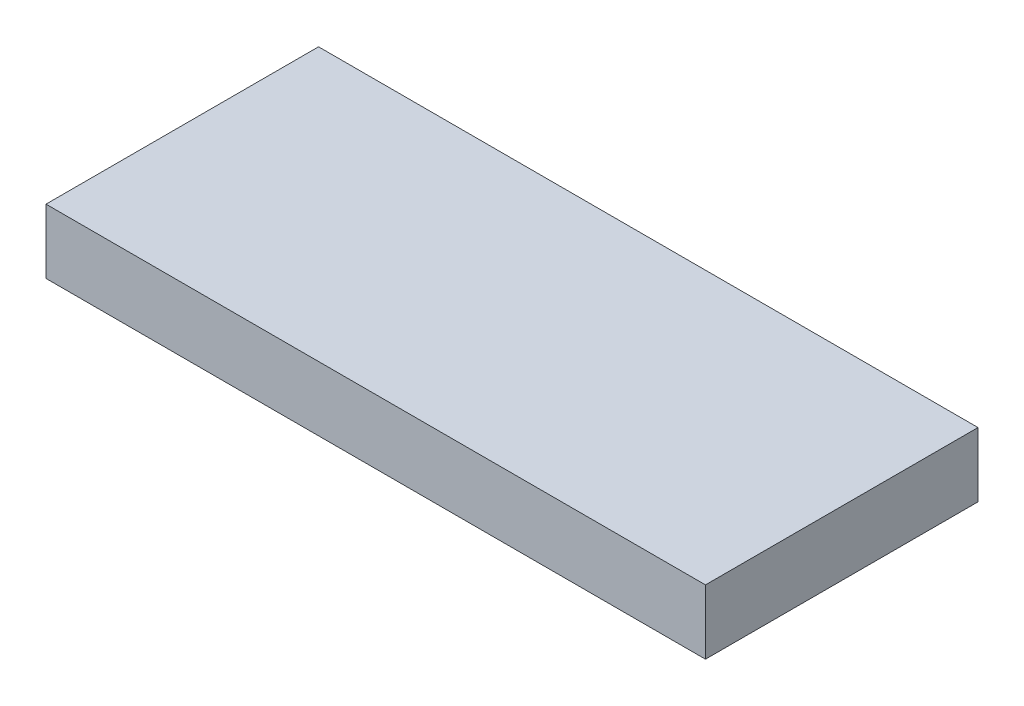
ISO-10303-21;
HEADER;
FILE_DESCRIPTION(('STEP AP214'),'2;1');
FILE_NAME('part.step','',(''),(''),'','','');
FILE_SCHEMA(('AUTOMOTIVE_DESIGN { 1 0 10303 214 1 1 1 1 }'));
ENDSEC;
DATA;
#1=APPLICATION_CONTEXT('core data for automotive mechanical design processes');
#2=APPLICATION_PROTOCOL_DEFINITION('international standard','automotive_design',2000,#1);
#3=PRODUCT_CONTEXT('',#1,'mechanical');
#4=PRODUCT('Part','Part','',(#3));
#5=PRODUCT_RELATED_PRODUCT_CATEGORY('part','',(#4));
#6=PRODUCT_DEFINITION_FORMATION('','',#4);
#7=PRODUCT_DEFINITION_CONTEXT('part definition',#1,'design');
#8=PRODUCT_DEFINITION('design','',#6,#7);
#9=PRODUCT_DEFINITION_SHAPE('','',#8);
#10=(LENGTH_UNIT() NAMED_UNIT(*) SI_UNIT(.MILLI.,.METRE.));
#11=(NAMED_UNIT(*) PLANE_ANGLE_UNIT() SI_UNIT($,.RADIAN.));
#12=(NAMED_UNIT(*) SI_UNIT($,.STERADIAN.) SOLID_ANGLE_UNIT());
#13=UNCERTAINTY_MEASURE_WITH_UNIT(LENGTH_MEASURE(1.E-05),#10,'distance_accuracy_value','');
#14=(GEOMETRIC_REPRESENTATION_CONTEXT(3) GLOBAL_UNCERTAINTY_ASSIGNED_CONTEXT((#13)) GLOBAL_UNIT_ASSIGNED_CONTEXT((#10,
#11,#12)) REPRESENTATION_CONTEXT('',''));
#15=CARTESIAN_POINT('',(0.,0.,0.));
#16=DIRECTION('',(0.,0.,1.));
#17=DIRECTION('',(1.,0.,0.));
#18=AXIS2_PLACEMENT_3D('',#15,#16,#17);
#19=CARTESIAN_POINT('',(-15.365,3.,6.35));
#20=DIRECTION('',(1.,0.,0.));
#21=DIRECTION('',(0.,0.,-1.));
#22=AXIS2_PLACEMENT_3D('',#19,#20,#21);
#23=PLANE('',#22);
#24=DIRECTION('',(0.,0.,1.));
#25=VECTOR('',#24,1.);
#26=CARTESIAN_POINT('',(-15.365,0.,6.35));
#27=LINE('',#26,#25);
#28=CARTESIAN_POINT('',(-15.365,0.,-6.35));
#29=VERTEX_POINT('',#28);
#30=CARTESIAN_POINT('',(-15.365,0.,6.35));
#31=VERTEX_POINT('',#30);
#32=EDGE_CURVE('E118',#29,#31,#27,.T.);
#33=ORIENTED_EDGE('',*,*,#32,.T.);
#34=DIRECTION('',(0.,-1.,0.));
#35=VECTOR('',#34,1.);
#36=CARTESIAN_POINT('',(-15.365,3.,6.35));
#37=LINE('',#36,#35);
#38=CARTESIAN_POINT('',(-15.365,3.,6.35));
#39=VERTEX_POINT('',#38);
#40=EDGE_CURVE('E11',#39,#31,#37,.T.);
#41=ORIENTED_EDGE('',*,*,#40,.F.);
#42=DIRECTION('',(0.,0.,1.));
#43=VECTOR('',#42,1.);
#44=CARTESIAN_POINT('',(-15.365,3.,6.35));
#45=LINE('',#44,#43);
#46=CARTESIAN_POINT('',(-15.365,3.,-6.35));
#47=VERTEX_POINT('',#46);
#48=EDGE_CURVE('E101',#47,#39,#45,.T.);
#49=ORIENTED_EDGE('',*,*,#48,.F.);
#50=DIRECTION('',(0.,-1.,0.));
#51=VECTOR('',#50,1.);
#52=CARTESIAN_POINT('',(-15.365,3.,-6.35));
#53=LINE('',#52,#51);
#54=EDGE_CURVE('E114',#47,#29,#53,.T.);
#55=ORIENTED_EDGE('',*,*,#54,.T.);
#56=EDGE_LOOP('',(#33,#41,#49,#55));
#57=FACE_BOUND('',#56,.T.);
#58=ADVANCED_FACE('F49',(#57),#23,.F.);
#59=CARTESIAN_POINT('',(15.365,3.,6.35));
#60=DIRECTION('',(0.,0.,-1.));
#61=DIRECTION('',(-1.,0.,0.));
#62=AXIS2_PLACEMENT_3D('',#59,#60,#61);
#63=PLANE('',#62);
#64=DIRECTION('',(1.,0.,0.));
#65=VECTOR('',#64,1.);
#66=CARTESIAN_POINT('',(15.365,0.,6.35));
#67=LINE('',#66,#65);
#68=CARTESIAN_POINT('',(15.365,0.,6.35));
#69=VERTEX_POINT('',#68);
#70=EDGE_CURVE('E106',#31,#69,#67,.T.);
#71=ORIENTED_EDGE('',*,*,#70,.T.);
#72=DIRECTION('',(0.,-1.,0.));
#73=VECTOR('',#72,1.);
#74=CARTESIAN_POINT('',(15.365,3.,6.35));
#75=LINE('',#74,#73);
#76=CARTESIAN_POINT('',(15.365,3.,6.35));
#77=VERTEX_POINT('',#76);
#78=EDGE_CURVE('E58',#77,#69,#75,.T.);
#79=ORIENTED_EDGE('',*,*,#78,.F.);
#80=DIRECTION('',(1.,0.,0.));
#81=VECTOR('',#80,1.);
#82=CARTESIAN_POINT('',(15.365,3.,6.35));
#83=LINE('',#82,#81);
#84=EDGE_CURVE('E96',#39,#77,#83,.T.);
#85=ORIENTED_EDGE('',*,*,#84,.F.);
#86=ORIENTED_EDGE('',*,*,#40,.T.);
#87=EDGE_LOOP('',(#71,#79,#85,#86));
#88=FACE_BOUND('',#87,.T.);
#89=ADVANCED_FACE('F105',(#88),#63,.F.);
#90=CARTESIAN_POINT('',(15.365,3.,6.35));
#91=DIRECTION('',(-1.,0.,0.));
#92=DIRECTION('',(0.,0.,1.));
#93=AXIS2_PLACEMENT_3D('',#90,#91,#92);
#94=PLANE('',#93);
#95=DIRECTION('',(0.,0.,-1.));
#96=VECTOR('',#95,1.);
#97=CARTESIAN_POINT('',(15.365,0.,6.35));
#98=LINE('',#97,#96);
#99=CARTESIAN_POINT('',(15.365,0.,-6.35));
#100=VERTEX_POINT('',#99);
#101=EDGE_CURVE('E83',#69,#100,#98,.T.);
#102=ORIENTED_EDGE('',*,*,#101,.T.);
#103=DIRECTION('',(0.,-1.,0.));
#104=VECTOR('',#103,1.);
#105=CARTESIAN_POINT('',(15.365,3.,-6.35));
#106=LINE('',#105,#104);
#107=CARTESIAN_POINT('',(15.365,3.,-6.35));
#108=VERTEX_POINT('',#107);
#109=EDGE_CURVE('E108',#108,#100,#106,.T.);
#110=ORIENTED_EDGE('',*,*,#109,.F.);
#111=DIRECTION('',(0.,0.,-1.));
#112=VECTOR('',#111,1.);
#113=CARTESIAN_POINT('',(15.365,3.,6.35));
#114=LINE('',#113,#112);
#115=EDGE_CURVE('E99',#77,#108,#114,.T.);
#116=ORIENTED_EDGE('',*,*,#115,.F.);
#117=ORIENTED_EDGE('',*,*,#78,.T.);
#118=EDGE_LOOP('',(#102,#110,#116,#117));
#119=FACE_BOUND('',#118,.T.);
#120=ADVANCED_FACE('F109',(#119),#94,.F.);
#121=CARTESIAN_POINT('',(15.365,3.,-6.35));
#122=DIRECTION('',(0.,0.,1.));
#123=DIRECTION('',(1.,0.,0.));
#124=AXIS2_PLACEMENT_3D('',#121,#122,#123);
#125=PLANE('',#124);
#126=DIRECTION('',(-1.,0.,0.));
#127=VECTOR('',#126,1.);
#128=CARTESIAN_POINT('',(15.365,0.,-6.35));
#129=LINE('',#128,#127);
#130=EDGE_CURVE('E89',#100,#29,#129,.T.);
#131=ORIENTED_EDGE('',*,*,#130,.T.);
#132=ORIENTED_EDGE('',*,*,#54,.F.);
#133=DIRECTION('',(-1.,0.,0.));
#134=VECTOR('',#133,1.);
#135=CARTESIAN_POINT('',(15.365,3.,-6.35));
#136=LINE('',#135,#134);
#137=EDGE_CURVE('E66',#108,#47,#136,.T.);
#138=ORIENTED_EDGE('',*,*,#137,.F.);
#139=ORIENTED_EDGE('',*,*,#109,.T.);
#140=EDGE_LOOP('',(#131,#132,#138,#139));
#141=FACE_BOUND('',#140,.T.);
#142=ADVANCED_FACE('F132',(#141),#125,.F.);
#143=CARTESIAN_POINT('',(0.,3.,0.));
#144=DIRECTION('',(0.,1.,0.));
#145=DIRECTION('',(0.,0.,1.));
#146=AXIS2_PLACEMENT_3D('',#143,#144,#145);
#147=PLANE('',#146);
#148=ORIENTED_EDGE('',*,*,#48,.T.);
#149=ORIENTED_EDGE('',*,*,#84,.T.);
#150=ORIENTED_EDGE('',*,*,#115,.T.);
#151=ORIENTED_EDGE('',*,*,#137,.T.);
#152=EDGE_LOOP('',(#148,#149,#150,#151));
#153=FACE_BOUND('',#152,.T.);
#154=ADVANCED_FACE('F97',(#153),#147,.T.);
#155=CARTESIAN_POINT('',(0.,0.,0.));
#156=DIRECTION('',(0.,1.,0.));
#157=DIRECTION('',(0.,0.,1.));
#158=AXIS2_PLACEMENT_3D('',#155,#156,#157);
#159=PLANE('',#158);
#160=ORIENTED_EDGE('',*,*,#32,.F.);
#161=ORIENTED_EDGE('',*,*,#130,.F.);
#162=ORIENTED_EDGE('',*,*,#101,.F.);
#163=ORIENTED_EDGE('',*,*,#70,.F.);
#164=EDGE_LOOP('',(#160,#161,#162,#163));
#165=FACE_BOUND('',#164,.T.);
#166=ADVANCED_FACE('F135',(#165),#159,.F.);
#167=CLOSED_SHELL('',(#58,#89,#120,#142,#154,#166));
#168=MANIFOLD_SOLID_BREP('B2',#167);
#169=ADVANCED_BREP_SHAPE_REPRESENTATION('',(#18,#168),#14);
#170=SHAPE_DEFINITION_REPRESENTATION(#9,#169);
ENDSEC;
END-ISO-10303-21;
